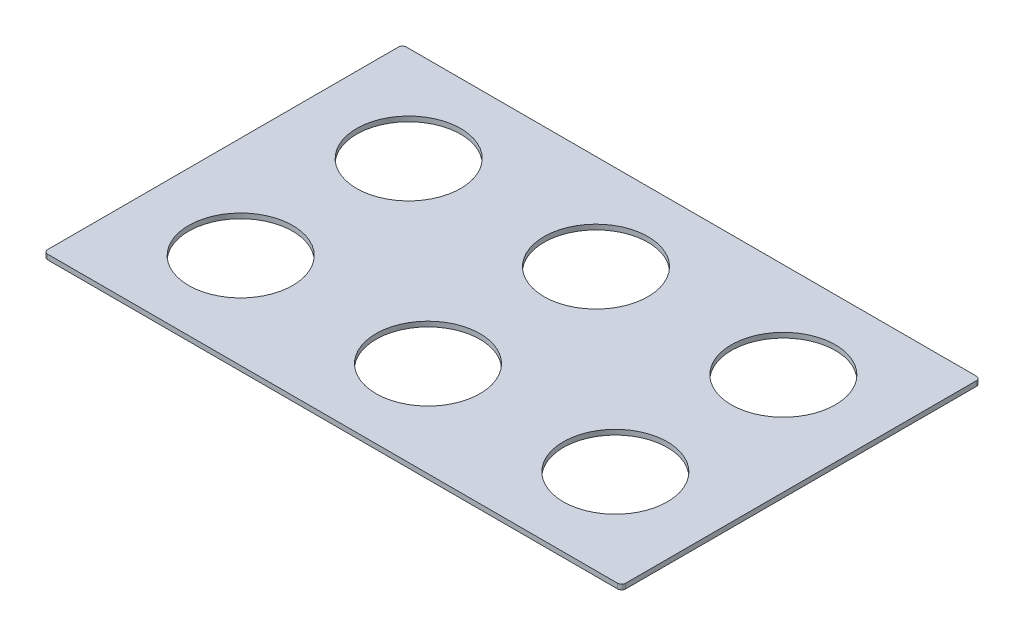
ISO-10303-21;
HEADER;
FILE_DESCRIPTION(('STEP AP214'),'2;1');
FILE_NAME('part.step','',(''),(''),'','','');
FILE_SCHEMA(('AUTOMOTIVE_DESIGN { 1 0 10303 214 1 1 1 1 }'));
ENDSEC;
DATA;
#1=APPLICATION_CONTEXT('core data for automotive mechanical design processes');
#2=APPLICATION_PROTOCOL_DEFINITION('international standard','automotive_design',2000,#1);
#3=PRODUCT_CONTEXT('',#1,'mechanical');
#4=PRODUCT('Part','Part','',(#3));
#5=PRODUCT_RELATED_PRODUCT_CATEGORY('part','',(#4));
#6=PRODUCT_DEFINITION_FORMATION('','',#4);
#7=PRODUCT_DEFINITION_CONTEXT('part definition',#1,'design');
#8=PRODUCT_DEFINITION('design','',#6,#7);
#9=PRODUCT_DEFINITION_SHAPE('','',#8);
#10=(LENGTH_UNIT() NAMED_UNIT(*) SI_UNIT(.MILLI.,.METRE.));
#11=(NAMED_UNIT(*) PLANE_ANGLE_UNIT() SI_UNIT($,.RADIAN.));
#12=(NAMED_UNIT(*) SI_UNIT($,.STERADIAN.) SOLID_ANGLE_UNIT());
#13=UNCERTAINTY_MEASURE_WITH_UNIT(LENGTH_MEASURE(1.E-05),#10,'distance_accuracy_value','');
#14=(GEOMETRIC_REPRESENTATION_CONTEXT(3) GLOBAL_UNCERTAINTY_ASSIGNED_CONTEXT((#13)) GLOBAL_UNIT_ASSIGNED_CONTEXT((#10,
#11,#12)) REPRESENTATION_CONTEXT('',''));
#15=CARTESIAN_POINT('',(0.,0.,0.));
#16=DIRECTION('',(0.,0.,1.));
#17=DIRECTION('',(1.,0.,0.));
#18=AXIS2_PLACEMENT_3D('',#15,#16,#17);
#19=CARTESIAN_POINT('',(0.,3.175,0.));
#20=DIRECTION('',(0.,-1.,0.));
#21=DIRECTION('',(0.,0.,-1.));
#22=AXIS2_PLACEMENT_3D('',#19,#20,#21);
#23=PLANE('',#22);
#24=DIRECTION('',(0.,0.,1.));
#25=VECTOR('',#24,1.);
#26=CARTESIAN_POINT('',(-184.15,3.175,114.3));
#27=LINE('',#26,#25);
#28=CARTESIAN_POINT('',(-184.15,3.175,-111.76));
#29=VERTEX_POINT('',#28);
#30=CARTESIAN_POINT('',(-184.15,3.175,111.76));
#31=VERTEX_POINT('',#30);
#32=EDGE_CURVE('E171',#29,#31,#27,.T.);
#33=ORIENTED_EDGE('',*,*,#32,.T.);
#34=CARTESIAN_POINT('',(-181.61,3.175,111.76));
#35=DIRECTION('',(0.,-1.,0.));
#36=DIRECTION('',(0.,0.,-1.));
#37=AXIS2_PLACEMENT_3D('',#34,#35,#36);
#38=CIRCLE('',#37,2.54);
#39=CARTESIAN_POINT('',(-181.61,3.175,114.3));
#40=VERTEX_POINT('',#39);
#41=EDGE_CURVE('E148',#31,#40,#38,.F.);
#42=ORIENTED_EDGE('',*,*,#41,.T.);
#43=DIRECTION('',(1.,0.,0.));
#44=VECTOR('',#43,1.);
#45=CARTESIAN_POINT('',(-184.15,3.175,114.3));
#46=LINE('',#45,#44);
#47=CARTESIAN_POINT('',(181.61,3.175,114.3));
#48=VERTEX_POINT('',#47);
#49=EDGE_CURVE('E119',#40,#48,#46,.T.);
#50=ORIENTED_EDGE('',*,*,#49,.T.);
#51=CARTESIAN_POINT('',(181.61,3.175,111.76));
#52=DIRECTION('',(0.,-1.,0.));
#53=DIRECTION('',(0.,0.,-1.));
#54=AXIS2_PLACEMENT_3D('',#51,#52,#53);
#55=CIRCLE('',#54,2.54);
#56=CARTESIAN_POINT('',(184.15,3.175,111.76));
#57=VERTEX_POINT('',#56);
#58=EDGE_CURVE('E146',#48,#57,#55,.F.);
#59=ORIENTED_EDGE('',*,*,#58,.T.);
#60=DIRECTION('',(0.,0.,-1.));
#61=VECTOR('',#60,1.);
#62=CARTESIAN_POINT('',(184.15,3.175,114.3));
#63=LINE('',#62,#61);
#64=CARTESIAN_POINT('',(184.15,3.175,-111.76));
#65=VERTEX_POINT('',#64);
#66=EDGE_CURVE('E126',#57,#65,#63,.T.);
#67=ORIENTED_EDGE('',*,*,#66,.T.);
#68=CARTESIAN_POINT('',(181.61,3.175,-111.76));
#69=DIRECTION('',(0.,-1.,0.));
#70=DIRECTION('',(0.,0.,-1.));
#71=AXIS2_PLACEMENT_3D('',#68,#69,#70);
#72=CIRCLE('',#71,2.54);
#73=CARTESIAN_POINT('',(181.61,3.175,-114.3));
#74=VERTEX_POINT('',#73);
#75=EDGE_CURVE('E54',#65,#74,#72,.F.);
#76=ORIENTED_EDGE('',*,*,#75,.T.);
#77=DIRECTION('',(-1.,0.,0.));
#78=VECTOR('',#77,1.);
#79=CARTESIAN_POINT('',(-184.15,3.175,-114.3));
#80=LINE('',#79,#78);
#81=CARTESIAN_POINT('',(-181.61,3.175,-114.3));
#82=VERTEX_POINT('',#81);
#83=EDGE_CURVE('E129',#74,#82,#80,.T.);
#84=ORIENTED_EDGE('',*,*,#83,.T.);
#85=CARTESIAN_POINT('',(-181.61,3.175,-111.76));
#86=DIRECTION('',(0.,-1.,0.));
#87=DIRECTION('',(0.,0.,-1.));
#88=AXIS2_PLACEMENT_3D('',#85,#86,#87);
#89=CIRCLE('',#88,2.54);
#90=EDGE_CURVE('E143',#82,#29,#89,.F.);
#91=ORIENTED_EDGE('',*,*,#90,.T.);
#92=EDGE_LOOP('',(#33,#42,#50,#59,#67,#76,#84,#91));
#93=FACE_BOUND('',#92,.T.);
#94=CARTESIAN_POINT('',(119.38,3.175,-53.5305));
#95=DIRECTION('',(0.,1.,0.));
#96=DIRECTION('',(0.,0.,1.));
#97=AXIS2_PLACEMENT_3D('',#94,#95,#96);
#98=CIRCLE('',#97,33.147);
#99=CARTESIAN_POINT('',(119.38,3.175,-20.3835));
#100=VERTEX_POINT('',#99);
#101=EDGE_CURVE('E164',#100,#100,#98,.T.);
#102=ORIENTED_EDGE('',*,*,#101,.F.);
#103=EDGE_LOOP('',(#102));
#104=FACE_BOUND('',#103,.T.);
#105=CARTESIAN_POINT('',(0.,3.175,-53.5305000000008));
#106=DIRECTION('',(0.,1.,0.));
#107=DIRECTION('',(0.,0.,1.));
#108=AXIS2_PLACEMENT_3D('',#105,#106,#107);
#109=CIRCLE('',#108,33.147);
#110=CARTESIAN_POINT('',(0.,3.175,-20.3835000000008));
#111=VERTEX_POINT('',#110);
#112=EDGE_CURVE('E176',#111,#111,#109,.T.);
#113=ORIENTED_EDGE('',*,*,#112,.F.);
#114=EDGE_LOOP('',(#113));
#115=FACE_BOUND('',#114,.T.);
#116=CARTESIAN_POINT('',(-119.38,3.175,-53.5305000000017));
#117=DIRECTION('',(0.,1.,0.));
#118=DIRECTION('',(0.,0.,1.));
#119=AXIS2_PLACEMENT_3D('',#116,#117,#118);
#120=CIRCLE('',#119,33.147);
#121=CARTESIAN_POINT('',(-119.38,3.175,-20.3835000000017));
#122=VERTEX_POINT('',#121);
#123=EDGE_CURVE('E181',#122,#122,#120,.T.);
#124=ORIENTED_EDGE('',*,*,#123,.F.);
#125=EDGE_LOOP('',(#124));
#126=FACE_BOUND('',#125,.T.);
#127=CARTESIAN_POINT('',(-119.38,3.175,53.5304999999991));
#128=DIRECTION('',(0.,1.,0.));
#129=DIRECTION('',(0.,0.,1.));
#130=AXIS2_PLACEMENT_3D('',#127,#128,#129);
#131=CIRCLE('',#130,33.147);
#132=CARTESIAN_POINT('',(-119.38,3.175,86.6774999999991));
#133=VERTEX_POINT('',#132);
#134=EDGE_CURVE('E187',#133,#133,#131,.T.);
#135=ORIENTED_EDGE('',*,*,#134,.F.);
#136=EDGE_LOOP('',(#135));
#137=FACE_BOUND('',#136,.T.);
#138=CARTESIAN_POINT('',(0.,3.175,53.5304999999992));
#139=DIRECTION('',(0.,1.,0.));
#140=DIRECTION('',(0.,0.,1.));
#141=AXIS2_PLACEMENT_3D('',#138,#139,#140);
#142=CIRCLE('',#141,33.147);
#143=CARTESIAN_POINT('',(0.,3.175,86.6774999999992));
#144=VERTEX_POINT('',#143);
#145=EDGE_CURVE('E193',#144,#144,#142,.T.);
#146=ORIENTED_EDGE('',*,*,#145,.F.);
#147=EDGE_LOOP('',(#146));
#148=FACE_BOUND('',#147,.T.);
#149=CARTESIAN_POINT('',(119.38,3.175,53.5305));
#150=DIRECTION('',(0.,1.,0.));
#151=DIRECTION('',(0.,0.,1.));
#152=AXIS2_PLACEMENT_3D('',#149,#150,#151);
#153=CIRCLE('',#152,33.147);
#154=CARTESIAN_POINT('',(119.38,3.175,86.6775));
#155=VERTEX_POINT('',#154);
#156=EDGE_CURVE('E199',#155,#155,#153,.T.);
#157=ORIENTED_EDGE('',*,*,#156,.F.);
#158=EDGE_LOOP('',(#157));
#159=FACE_BOUND('',#158,.T.);
#160=ADVANCED_FACE('F33',(#93,#104,#115,#126,#137,#148,#159),#23,.F.);
#161=CARTESIAN_POINT('',(0.,0.,0.));
#162=DIRECTION('',(0.,-1.,0.));
#163=DIRECTION('',(0.,0.,-1.));
#164=AXIS2_PLACEMENT_3D('',#161,#162,#163);
#165=PLANE('',#164);
#166=CARTESIAN_POINT('',(0.,0.,53.5304999999992));
#167=DIRECTION('',(0.,1.,0.));
#168=DIRECTION('',(0.,0.,1.));
#169=AXIS2_PLACEMENT_3D('',#166,#167,#168);
#170=CIRCLE('',#169,33.147);
#171=CARTESIAN_POINT('',(0.,0.,86.6774999999992));
#172=VERTEX_POINT('',#171);
#173=EDGE_CURVE('E196',#172,#172,#170,.T.);
#174=ORIENTED_EDGE('',*,*,#173,.T.);
#175=EDGE_LOOP('',(#174));
#176=FACE_BOUND('',#175,.T.);
#177=CARTESIAN_POINT('',(-119.38,0.,-53.5305000000017));
#178=DIRECTION('',(0.,1.,0.));
#179=DIRECTION('',(0.,0.,1.));
#180=AXIS2_PLACEMENT_3D('',#177,#178,#179);
#181=CIRCLE('',#180,33.147);
#182=CARTESIAN_POINT('',(-119.38,0.,-20.3835000000017));
#183=VERTEX_POINT('',#182);
#184=EDGE_CURVE('E184',#183,#183,#181,.T.);
#185=ORIENTED_EDGE('',*,*,#184,.T.);
#186=EDGE_LOOP('',(#185));
#187=FACE_BOUND('',#186,.T.);
#188=CARTESIAN_POINT('',(119.38,0.,-53.5305));
#189=DIRECTION('',(0.,1.,0.));
#190=DIRECTION('',(0.,0.,1.));
#191=AXIS2_PLACEMENT_3D('',#188,#189,#190);
#192=CIRCLE('',#191,33.147);
#193=CARTESIAN_POINT('',(119.38,0.,-20.3835));
#194=VERTEX_POINT('',#193);
#195=EDGE_CURVE('E167',#194,#194,#192,.T.);
#196=ORIENTED_EDGE('',*,*,#195,.T.);
#197=EDGE_LOOP('',(#196));
#198=FACE_BOUND('',#197,.T.);
#199=DIRECTION('',(1.,0.,0.));
#200=VECTOR('',#199,1.);
#201=CARTESIAN_POINT('',(-184.15,0.,114.3));
#202=LINE('',#201,#200);
#203=CARTESIAN_POINT('',(-181.61,0.,114.3));
#204=VERTEX_POINT('',#203);
#205=CARTESIAN_POINT('',(181.61,0.,114.3));
#206=VERTEX_POINT('',#205);
#207=EDGE_CURVE('E116',#204,#206,#202,.T.);
#208=ORIENTED_EDGE('',*,*,#207,.F.);
#209=CARTESIAN_POINT('',(-181.61,0.,111.76));
#210=DIRECTION('',(0.,-1.,0.));
#211=DIRECTION('',(0.,0.,-1.));
#212=AXIS2_PLACEMENT_3D('',#209,#210,#211);
#213=CIRCLE('',#212,2.54);
#214=CARTESIAN_POINT('',(-184.15,0.,111.76));
#215=VERTEX_POINT('',#214);
#216=EDGE_CURVE('E99',#204,#215,#213,.T.);
#217=ORIENTED_EDGE('',*,*,#216,.T.);
#218=DIRECTION('',(0.,0.,1.));
#219=VECTOR('',#218,1.);
#220=CARTESIAN_POINT('',(-184.15,0.,114.3));
#221=LINE('',#220,#219);
#222=CARTESIAN_POINT('',(-184.15,0.,-111.76));
#223=VERTEX_POINT('',#222);
#224=EDGE_CURVE('E127',#223,#215,#221,.T.);
#225=ORIENTED_EDGE('',*,*,#224,.F.);
#226=CARTESIAN_POINT('',(-181.61,0.,-111.76));
#227=DIRECTION('',(0.,-1.,0.));
#228=DIRECTION('',(0.,0.,-1.));
#229=AXIS2_PLACEMENT_3D('',#226,#227,#228);
#230=CIRCLE('',#229,2.54);
#231=CARTESIAN_POINT('',(-181.61,0.,-114.3));
#232=VERTEX_POINT('',#231);
#233=EDGE_CURVE('E120',#223,#232,#230,.T.);
#234=ORIENTED_EDGE('',*,*,#233,.T.);
#235=DIRECTION('',(-1.,0.,0.));
#236=VECTOR('',#235,1.);
#237=CARTESIAN_POINT('',(-184.15,0.,-114.3));
#238=LINE('',#237,#236);
#239=CARTESIAN_POINT('',(181.61,0.,-114.3));
#240=VERTEX_POINT('',#239);
#241=EDGE_CURVE('E131',#240,#232,#238,.T.);
#242=ORIENTED_EDGE('',*,*,#241,.F.);
#243=CARTESIAN_POINT('',(181.61,0.,-111.76));
#244=DIRECTION('',(0.,-1.,0.));
#245=DIRECTION('',(0.,0.,-1.));
#246=AXIS2_PLACEMENT_3D('',#243,#244,#245);
#247=CIRCLE('',#246,2.54);
#248=CARTESIAN_POINT('',(184.15,0.,-111.76));
#249=VERTEX_POINT('',#248);
#250=EDGE_CURVE('E137',#240,#249,#247,.T.);
#251=ORIENTED_EDGE('',*,*,#250,.T.);
#252=DIRECTION('',(0.,0.,-1.));
#253=VECTOR('',#252,1.);
#254=CARTESIAN_POINT('',(184.15,0.,114.3));
#255=LINE('',#254,#253);
#256=CARTESIAN_POINT('',(184.15,0.,111.76));
#257=VERTEX_POINT('',#256);
#258=EDGE_CURVE('E159',#257,#249,#255,.T.);
#259=ORIENTED_EDGE('',*,*,#258,.F.);
#260=CARTESIAN_POINT('',(181.61,0.,111.76));
#261=DIRECTION('',(0.,-1.,0.));
#262=DIRECTION('',(0.,0.,-1.));
#263=AXIS2_PLACEMENT_3D('',#260,#261,#262);
#264=CIRCLE('',#263,2.54);
#265=EDGE_CURVE('E110',#257,#206,#264,.T.);
#266=ORIENTED_EDGE('',*,*,#265,.T.);
#267=EDGE_LOOP('',(#208,#217,#225,#234,#242,#251,#259,#266));
#268=FACE_BOUND('',#267,.T.);
#269=CARTESIAN_POINT('',(0.,0.,-53.5305000000008));
#270=DIRECTION('',(0.,1.,0.));
#271=DIRECTION('',(0.,0.,1.));
#272=AXIS2_PLACEMENT_3D('',#269,#270,#271);
#273=CIRCLE('',#272,33.147);
#274=CARTESIAN_POINT('',(0.,0.,-20.3835000000008));
#275=VERTEX_POINT('',#274);
#276=EDGE_CURVE('E178',#275,#275,#273,.T.);
#277=ORIENTED_EDGE('',*,*,#276,.T.);
#278=EDGE_LOOP('',(#277));
#279=FACE_BOUND('',#278,.T.);
#280=CARTESIAN_POINT('',(-119.38,0.,53.5304999999991));
#281=DIRECTION('',(0.,1.,0.));
#282=DIRECTION('',(0.,0.,1.));
#283=AXIS2_PLACEMENT_3D('',#280,#281,#282);
#284=CIRCLE('',#283,33.147);
#285=CARTESIAN_POINT('',(-119.38,0.,86.6774999999991));
#286=VERTEX_POINT('',#285);
#287=EDGE_CURVE('E190',#286,#286,#284,.T.);
#288=ORIENTED_EDGE('',*,*,#287,.T.);
#289=EDGE_LOOP('',(#288));
#290=FACE_BOUND('',#289,.T.);
#291=CARTESIAN_POINT('',(119.38,0.,53.5305));
#292=DIRECTION('',(0.,1.,0.));
#293=DIRECTION('',(0.,0.,1.));
#294=AXIS2_PLACEMENT_3D('',#291,#292,#293);
#295=CIRCLE('',#294,33.147);
#296=CARTESIAN_POINT('',(119.38,0.,86.6775));
#297=VERTEX_POINT('',#296);
#298=EDGE_CURVE('E202',#297,#297,#295,.T.);
#299=ORIENTED_EDGE('',*,*,#298,.T.);
#300=EDGE_LOOP('',(#299));
#301=FACE_BOUND('',#300,.T.);
#302=ADVANCED_FACE('F123',(#176,#187,#198,#268,#279,#290,#301),#165,.T.);
#303=CARTESIAN_POINT('',(184.15,3.175,114.3));
#304=DIRECTION('',(-1.,0.,0.));
#305=DIRECTION('',(0.,0.,1.));
#306=AXIS2_PLACEMENT_3D('',#303,#304,#305);
#307=PLANE('',#306);
#308=ORIENTED_EDGE('',*,*,#66,.F.);
#309=DIRECTION('',(0.,-1.,0.));
#310=VECTOR('',#309,1.);
#311=CARTESIAN_POINT('',(184.15,3.175,111.76));
#312=LINE('',#311,#310);
#313=EDGE_CURVE('E152',#57,#257,#312,.T.);
#314=ORIENTED_EDGE('',*,*,#313,.T.);
#315=ORIENTED_EDGE('',*,*,#258,.T.);
#316=DIRECTION('',(0.,-1.,0.));
#317=VECTOR('',#316,1.);
#318=CARTESIAN_POINT('',(184.15,3.175,-111.76));
#319=LINE('',#318,#317);
#320=EDGE_CURVE('E150',#249,#65,#319,.F.);
#321=ORIENTED_EDGE('',*,*,#320,.T.);
#322=EDGE_LOOP('',(#308,#314,#315,#321));
#323=FACE_BOUND('',#322,.T.);
#324=ADVANCED_FACE('F158',(#323),#307,.F.);
#325=CARTESIAN_POINT('',(-184.15,3.175,-114.3));
#326=DIRECTION('',(0.,0.,1.));
#327=DIRECTION('',(1.,0.,0.));
#328=AXIS2_PLACEMENT_3D('',#325,#326,#327);
#329=PLANE('',#328);
#330=ORIENTED_EDGE('',*,*,#83,.F.);
#331=DIRECTION('',(0.,-1.,0.));
#332=VECTOR('',#331,1.);
#333=CARTESIAN_POINT('',(181.61,3.175,-114.3));
#334=LINE('',#333,#332);
#335=EDGE_CURVE('E11',#74,#240,#334,.T.);
#336=ORIENTED_EDGE('',*,*,#335,.T.);
#337=ORIENTED_EDGE('',*,*,#241,.T.);
#338=DIRECTION('',(0.,-1.,0.));
#339=VECTOR('',#338,1.);
#340=CARTESIAN_POINT('',(-181.61,3.175,-114.3));
#341=LINE('',#340,#339);
#342=EDGE_CURVE('E41',#232,#82,#341,.F.);
#343=ORIENTED_EDGE('',*,*,#342,.T.);
#344=EDGE_LOOP('',(#330,#336,#337,#343));
#345=FACE_BOUND('',#344,.T.);
#346=ADVANCED_FACE('F228',(#345),#329,.F.);
#347=CARTESIAN_POINT('',(-184.15,3.175,114.3));
#348=DIRECTION('',(1.,0.,0.));
#349=DIRECTION('',(0.,0.,-1.));
#350=AXIS2_PLACEMENT_3D('',#347,#348,#349);
#351=PLANE('',#350);
#352=ORIENTED_EDGE('',*,*,#224,.T.);
#353=DIRECTION('',(0.,-1.,0.));
#354=VECTOR('',#353,1.);
#355=CARTESIAN_POINT('',(-184.15,3.175,111.76));
#356=LINE('',#355,#354);
#357=EDGE_CURVE('E104',#215,#31,#356,.F.);
#358=ORIENTED_EDGE('',*,*,#357,.T.);
#359=ORIENTED_EDGE('',*,*,#32,.F.);
#360=DIRECTION('',(0.,-1.,0.));
#361=VECTOR('',#360,1.);
#362=CARTESIAN_POINT('',(-184.15,3.175,-111.76));
#363=LINE('',#362,#361);
#364=EDGE_CURVE('E109',#29,#223,#363,.T.);
#365=ORIENTED_EDGE('',*,*,#364,.T.);
#366=EDGE_LOOP('',(#352,#358,#359,#365));
#367=FACE_BOUND('',#366,.T.);
#368=ADVANCED_FACE('F225',(#367),#351,.F.);
#369=CARTESIAN_POINT('',(-184.15,3.175,114.3));
#370=DIRECTION('',(0.,0.,-1.));
#371=DIRECTION('',(-1.,0.,0.));
#372=AXIS2_PLACEMENT_3D('',#369,#370,#371);
#373=PLANE('',#372);
#374=ORIENTED_EDGE('',*,*,#49,.F.);
#375=DIRECTION('',(0.,-1.,0.));
#376=VECTOR('',#375,1.);
#377=CARTESIAN_POINT('',(-181.61,3.175,114.3));
#378=LINE('',#377,#376);
#379=EDGE_CURVE('E103',#40,#204,#378,.T.);
#380=ORIENTED_EDGE('',*,*,#379,.T.);
#381=ORIENTED_EDGE('',*,*,#207,.T.);
#382=DIRECTION('',(0.,-1.,0.));
#383=VECTOR('',#382,1.);
#384=CARTESIAN_POINT('',(181.61,3.175,114.3));
#385=LINE('',#384,#383);
#386=EDGE_CURVE('E121',#206,#48,#385,.F.);
#387=ORIENTED_EDGE('',*,*,#386,.T.);
#388=EDGE_LOOP('',(#374,#380,#381,#387));
#389=FACE_BOUND('',#388,.T.);
#390=ADVANCED_FACE('F115',(#389),#373,.F.);
#391=CARTESIAN_POINT('',(119.38,3.175,-53.5305));
#392=DIRECTION('',(0.,-1.,0.));
#393=DIRECTION('',(0.,0.,-1.));
#394=AXIS2_PLACEMENT_3D('',#391,#392,#393);
#395=CYLINDRICAL_SURFACE('',#394,33.147);
#396=ORIENTED_EDGE('',*,*,#101,.T.);
#397=EDGE_LOOP('',(#396));
#398=FACE_BOUND('',#397,.T.);
#399=ORIENTED_EDGE('',*,*,#195,.F.);
#400=EDGE_LOOP('',(#399));
#401=FACE_BOUND('',#400,.T.);
#402=ADVANCED_FACE('F220',(#398,#401),#395,.F.);
#403=CARTESIAN_POINT('',(0.,3.175,-53.5305000000008));
#404=DIRECTION('',(0.,-1.,0.));
#405=DIRECTION('',(0.,0.,-1.));
#406=AXIS2_PLACEMENT_3D('',#403,#404,#405);
#407=CYLINDRICAL_SURFACE('',#406,33.147);
#408=ORIENTED_EDGE('',*,*,#112,.T.);
#409=EDGE_LOOP('',(#408));
#410=FACE_BOUND('',#409,.T.);
#411=ORIENTED_EDGE('',*,*,#276,.F.);
#412=EDGE_LOOP('',(#411));
#413=FACE_BOUND('',#412,.T.);
#414=ADVANCED_FACE('F341',(#410,#413),#407,.F.);
#415=CARTESIAN_POINT('',(-119.38,3.175,-53.5305000000017));
#416=DIRECTION('',(0.,-1.,0.));
#417=DIRECTION('',(0.,0.,-1.));
#418=AXIS2_PLACEMENT_3D('',#415,#416,#417);
#419=CYLINDRICAL_SURFACE('',#418,33.147);
#420=ORIENTED_EDGE('',*,*,#123,.T.);
#421=EDGE_LOOP('',(#420));
#422=FACE_BOUND('',#421,.T.);
#423=ORIENTED_EDGE('',*,*,#184,.F.);
#424=EDGE_LOOP('',(#423));
#425=FACE_BOUND('',#424,.T.);
#426=ADVANCED_FACE('F331',(#422,#425),#419,.F.);
#427=CARTESIAN_POINT('',(-119.38,3.175,53.5304999999991));
#428=DIRECTION('',(0.,-1.,0.));
#429=DIRECTION('',(0.,0.,-1.));
#430=AXIS2_PLACEMENT_3D('',#427,#428,#429);
#431=CYLINDRICAL_SURFACE('',#430,33.147);
#432=ORIENTED_EDGE('',*,*,#134,.T.);
#433=EDGE_LOOP('',(#432));
#434=FACE_BOUND('',#433,.T.);
#435=ORIENTED_EDGE('',*,*,#287,.F.);
#436=EDGE_LOOP('',(#435));
#437=FACE_BOUND('',#436,.T.);
#438=ADVANCED_FACE('F321',(#434,#437),#431,.F.);
#439=CARTESIAN_POINT('',(0.,3.175,53.5304999999992));
#440=DIRECTION('',(0.,-1.,0.));
#441=DIRECTION('',(0.,0.,-1.));
#442=AXIS2_PLACEMENT_3D('',#439,#440,#441);
#443=CYLINDRICAL_SURFACE('',#442,33.147);
#444=ORIENTED_EDGE('',*,*,#145,.T.);
#445=EDGE_LOOP('',(#444));
#446=FACE_BOUND('',#445,.T.);
#447=ORIENTED_EDGE('',*,*,#173,.F.);
#448=EDGE_LOOP('',(#447));
#449=FACE_BOUND('',#448,.T.);
#450=ADVANCED_FACE('F312',(#446,#449),#443,.F.);
#451=CARTESIAN_POINT('',(119.38,3.175,53.5305));
#452=DIRECTION('',(0.,-1.,0.));
#453=DIRECTION('',(0.,0.,-1.));
#454=AXIS2_PLACEMENT_3D('',#451,#452,#453);
#455=CYLINDRICAL_SURFACE('',#454,33.147);
#456=ORIENTED_EDGE('',*,*,#156,.T.);
#457=EDGE_LOOP('',(#456));
#458=FACE_BOUND('',#457,.T.);
#459=ORIENTED_EDGE('',*,*,#298,.F.);
#460=EDGE_LOOP('',(#459));
#461=FACE_BOUND('',#460,.T.);
#462=ADVANCED_FACE('F208',(#458,#461),#455,.F.);
#463=CARTESIAN_POINT('',(-181.61,3.175,111.76));
#464=DIRECTION('',(0.,-1.,0.));
#465=DIRECTION('',(0.,0.,-1.));
#466=AXIS2_PLACEMENT_3D('',#463,#464,#465);
#467=CYLINDRICAL_SURFACE('',#466,2.54);
#468=ORIENTED_EDGE('',*,*,#41,.F.);
#469=ORIENTED_EDGE('',*,*,#357,.F.);
#470=ORIENTED_EDGE('',*,*,#216,.F.);
#471=ORIENTED_EDGE('',*,*,#379,.F.);
#472=EDGE_LOOP('',(#468,#469,#470,#471));
#473=FACE_BOUND('',#472,.T.);
#474=ADVANCED_FACE('F102',(#473),#467,.T.);
#475=CARTESIAN_POINT('',(181.61,3.175,111.76));
#476=DIRECTION('',(0.,-1.,0.));
#477=DIRECTION('',(0.,0.,-1.));
#478=AXIS2_PLACEMENT_3D('',#475,#476,#477);
#479=CYLINDRICAL_SURFACE('',#478,2.54);
#480=ORIENTED_EDGE('',*,*,#58,.F.);
#481=ORIENTED_EDGE('',*,*,#386,.F.);
#482=ORIENTED_EDGE('',*,*,#265,.F.);
#483=ORIENTED_EDGE('',*,*,#313,.F.);
#484=EDGE_LOOP('',(#480,#481,#482,#483));
#485=FACE_BOUND('',#484,.T.);
#486=ADVANCED_FACE('F236',(#485),#479,.T.);
#487=CARTESIAN_POINT('',(181.61,3.175,-111.76));
#488=DIRECTION('',(0.,-1.,0.));
#489=DIRECTION('',(0.,0.,-1.));
#490=AXIS2_PLACEMENT_3D('',#487,#488,#489);
#491=CYLINDRICAL_SURFACE('',#490,2.54);
#492=ORIENTED_EDGE('',*,*,#75,.F.);
#493=ORIENTED_EDGE('',*,*,#320,.F.);
#494=ORIENTED_EDGE('',*,*,#250,.F.);
#495=ORIENTED_EDGE('',*,*,#335,.F.);
#496=EDGE_LOOP('',(#492,#493,#494,#495));
#497=FACE_BOUND('',#496,.T.);
#498=ADVANCED_FACE('F238',(#497),#491,.T.);
#499=CARTESIAN_POINT('',(-181.61,3.175,-111.76));
#500=DIRECTION('',(0.,-1.,0.));
#501=DIRECTION('',(0.,0.,-1.));
#502=AXIS2_PLACEMENT_3D('',#499,#500,#501);
#503=CYLINDRICAL_SURFACE('',#502,2.54);
#504=ORIENTED_EDGE('',*,*,#90,.F.);
#505=ORIENTED_EDGE('',*,*,#342,.F.);
#506=ORIENTED_EDGE('',*,*,#233,.F.);
#507=ORIENTED_EDGE('',*,*,#364,.F.);
#508=EDGE_LOOP('',(#504,#505,#506,#507));
#509=FACE_BOUND('',#508,.T.);
#510=ADVANCED_FACE('F35',(#509),#503,.T.);
#511=CLOSED_SHELL('',(#160,#302,#324,#346,#368,#390,#402,#414,#426,#438,#450,#462,#474,#486,
#498,#510));
#512=MANIFOLD_SOLID_BREP('B2',#511);
#513=ADVANCED_BREP_SHAPE_REPRESENTATION('',(#18,#512),#14);
#514=SHAPE_DEFINITION_REPRESENTATION(#9,#513);
ENDSEC;
END-ISO-10303-21;
